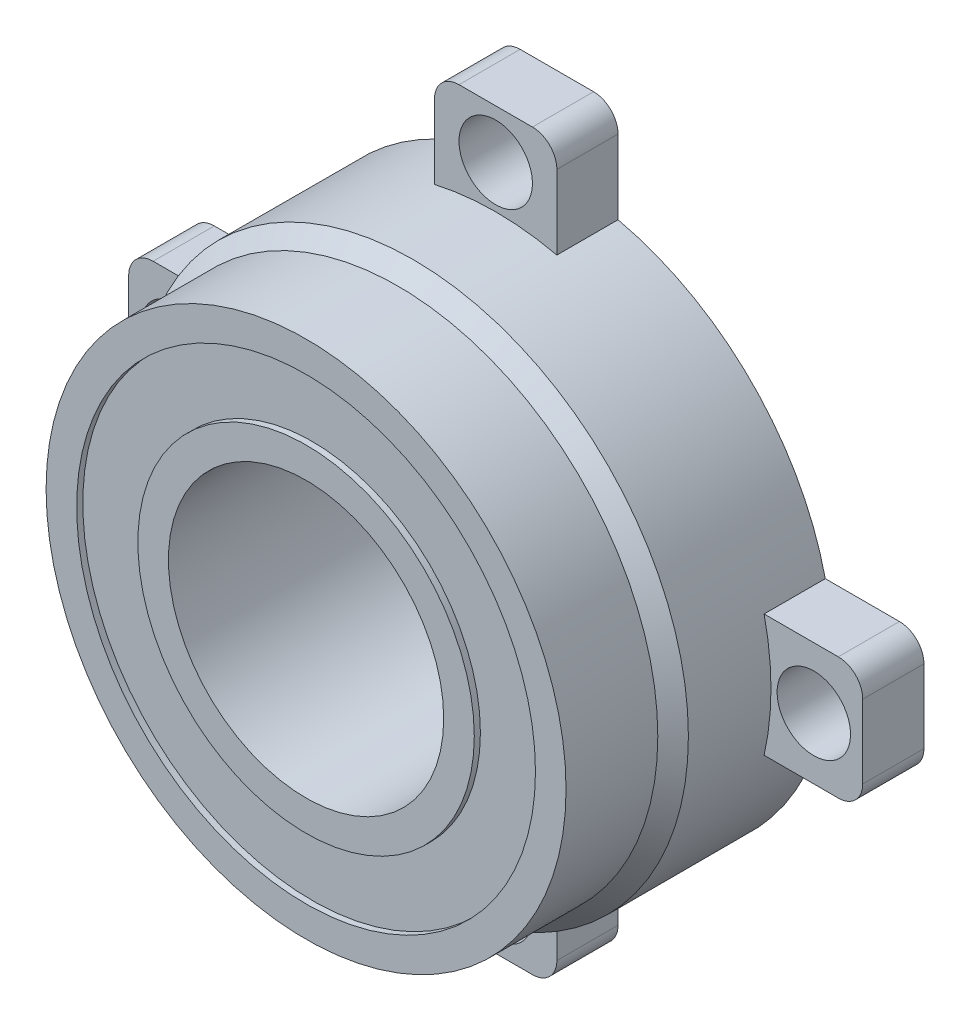
ISO-10303-21;
HEADER;
FILE_DESCRIPTION(('STEP AP214'),'2;1');
FILE_NAME('part.step','',(''),(''),'','','');
FILE_SCHEMA(('AUTOMOTIVE_DESIGN { 1 0 10303 214 1 1 1 1 }'));
ENDSEC;
DATA;
#1=APPLICATION_CONTEXT('core data for automotive mechanical design processes');
#2=APPLICATION_PROTOCOL_DEFINITION('international standard','automotive_design',2000,#1);
#3=PRODUCT_CONTEXT('',#1,'mechanical');
#4=PRODUCT('Part','Part','',(#3));
#5=PRODUCT_RELATED_PRODUCT_CATEGORY('part','',(#4));
#6=PRODUCT_DEFINITION_FORMATION('','',#4);
#7=PRODUCT_DEFINITION_CONTEXT('part definition',#1,'design');
#8=PRODUCT_DEFINITION('design','',#6,#7);
#9=PRODUCT_DEFINITION_SHAPE('','',#8);
#10=(LENGTH_UNIT() NAMED_UNIT(*) SI_UNIT(.MILLI.,.METRE.));
#11=(NAMED_UNIT(*) PLANE_ANGLE_UNIT() SI_UNIT($,.RADIAN.));
#12=(NAMED_UNIT(*) SI_UNIT($,.STERADIAN.) SOLID_ANGLE_UNIT());
#13=UNCERTAINTY_MEASURE_WITH_UNIT(LENGTH_MEASURE(1.E-05),#10,'distance_accuracy_value','');
#14=(GEOMETRIC_REPRESENTATION_CONTEXT(3) GLOBAL_UNCERTAINTY_ASSIGNED_CONTEXT((#13)) GLOBAL_UNIT_ASSIGNED_CONTEXT((#10,
#11,#12)) REPRESENTATION_CONTEXT('',''));
#15=CARTESIAN_POINT('',(0.,0.,0.));
#16=DIRECTION('',(0.,0.,1.));
#17=DIRECTION('',(1.,0.,0.));
#18=AXIS2_PLACEMENT_3D('',#15,#16,#17);
#19=CARTESIAN_POINT('',(0.,0.,41.));
#20=DIRECTION('',(0.,0.,1.));
#21=DIRECTION('',(1.,0.,0.));
#22=AXIS2_PLACEMENT_3D('',#19,#20,#21);
#23=PLANE('',#22);
#24=CARTESIAN_POINT('',(0.,0.,41.));
#25=DIRECTION('',(0.,0.,1.));
#26=DIRECTION('',(1.,0.,0.));
#27=AXIS2_PLACEMENT_3D('',#24,#25,#26);
#28=CIRCLE('',#27,22.5);
#29=CARTESIAN_POINT('',(22.5,0.,41.));
#30=VERTEX_POINT('',#29);
#31=EDGE_CURVE('E359',#30,#30,#28,.T.);
#32=ORIENTED_EDGE('',*,*,#31,.F.);
#33=EDGE_LOOP('',(#32));
#34=FACE_BOUND('',#33,.T.);
#35=CARTESIAN_POINT('',(0.,0.,41.));
#36=DIRECTION('',(0.,0.,1.));
#37=DIRECTION('',(1.,0.,0.));
#38=AXIS2_PLACEMENT_3D('',#35,#36,#37);
#39=CIRCLE('',#38,27.5);
#40=CARTESIAN_POINT('',(27.5,0.,41.));
#41=VERTEX_POINT('',#40);
#42=EDGE_CURVE('E856',#41,#41,#39,.T.);
#43=ORIENTED_EDGE('',*,*,#42,.T.);
#44=EDGE_LOOP('',(#43));
#45=FACE_BOUND('',#44,.T.);
#46=ADVANCED_FACE('F35',(#34,#45),#23,.T.);
#47=CARTESIAN_POINT('',(0.,0.,41.));
#48=DIRECTION('',(0.,0.,1.));
#49=DIRECTION('',(1.,0.,0.));
#50=AXIS2_PLACEMENT_3D('',#47,#48,#49);
#51=CIRCLE('',#50,37.5);
#52=CARTESIAN_POINT('',(37.5,0.,41.));
#53=VERTEX_POINT('',#52);
#54=EDGE_CURVE('E850',#53,#53,#51,.T.);
#55=ORIENTED_EDGE('',*,*,#54,.F.);
#56=EDGE_LOOP('',(#55));
#57=FACE_BOUND('',#56,.T.);
#58=CARTESIAN_POINT('',(0.,0.,41.));
#59=DIRECTION('',(0.,0.,1.));
#60=DIRECTION('',(1.,0.,0.));
#61=AXIS2_PLACEMENT_3D('',#58,#59,#60);
#62=CIRCLE('',#61,42.5);
#63=CARTESIAN_POINT('',(42.5,0.,41.));
#64=VERTEX_POINT('',#63);
#65=EDGE_CURVE('E836',#64,#64,#62,.T.);
#66=ORIENTED_EDGE('',*,*,#65,.T.);
#67=EDGE_LOOP('',(#66));
#68=FACE_BOUND('',#67,.T.);
#69=ADVANCED_FACE('F408',(#57,#68),#23,.T.);
#70=CARTESIAN_POINT('',(0.,0.,41.));
#71=DIRECTION('',(0.,0.,-1.));
#72=DIRECTION('',(-1.,0.,0.));
#73=AXIS2_PLACEMENT_3D('',#70,#71,#72);
#74=CYLINDRICAL_SURFACE('',#73,45.);
#75=CARTESIAN_POINT('',(0.,0.,23.5000000000001));
#76=DIRECTION('',(0.,0.,-1.));
#77=DIRECTION('',(-1.,0.,0.));
#78=AXIS2_PLACEMENT_3D('',#75,#76,#77);
#79=CIRCLE('',#78,45.);
#80=CARTESIAN_POINT('',(-45.,0.,23.5000000000001));
#81=VERTEX_POINT('',#80);
#82=EDGE_CURVE('E11',#81,#81,#79,.T.);
#83=ORIENTED_EDGE('',*,*,#82,.T.);
#84=EDGE_LOOP('',(#83));
#85=FACE_BOUND('',#84,.T.);
#86=CARTESIAN_POINT('',(0.,0.,0.));
#87=DIRECTION('',(0.,0.,1.));
#88=DIRECTION('',(1.,0.,0.));
#89=AXIS2_PLACEMENT_3D('',#86,#87,#88);
#90=CIRCLE('',#89,45.);
#91=CARTESIAN_POINT('',(9.99999999999999,-43.8748219369606,0.));
#92=VERTEX_POINT('',#91);
#93=CARTESIAN_POINT('',(43.8748219369606,-10.,0.));
#94=VERTEX_POINT('',#93);
#95=EDGE_CURVE('E429',#92,#94,#90,.T.);
#96=ORIENTED_EDGE('',*,*,#95,.T.);
#97=DIRECTION('',(0.,0.,-1.));
#98=VECTOR('',#97,1.);
#99=CARTESIAN_POINT('',(43.8748219369606,-10.,41.));
#100=LINE('',#99,#98);
#101=CARTESIAN_POINT('',(43.8748219369606,-10.,10.));
#102=VERTEX_POINT('',#101);
#103=EDGE_CURVE('E56',#94,#102,#100,.F.);
#104=ORIENTED_EDGE('',*,*,#103,.T.);
#105=CARTESIAN_POINT('',(0.,0.,10.));
#106=DIRECTION('',(0.,0.,1.));
#107=DIRECTION('',(1.,0.,0.));
#108=AXIS2_PLACEMENT_3D('',#105,#106,#107);
#109=CIRCLE('',#108,45.);
#110=CARTESIAN_POINT('',(43.8748219369606,9.99999999999999,10.));
#111=VERTEX_POINT('',#110);
#112=EDGE_CURVE('E51',#102,#111,#109,.T.);
#113=ORIENTED_EDGE('',*,*,#112,.T.);
#114=DIRECTION('',(0.,0.,-1.));
#115=VECTOR('',#114,1.);
#116=CARTESIAN_POINT('',(43.8748219369606,9.99999999999999,41.));
#117=LINE('',#116,#115);
#118=CARTESIAN_POINT('',(43.8748219369606,9.99999999999999,0.));
#119=VERTEX_POINT('',#118);
#120=EDGE_CURVE('E202',#111,#119,#117,.T.);
#121=ORIENTED_EDGE('',*,*,#120,.T.);
#122=CARTESIAN_POINT('',(10.,43.8748219369606,0.));
#123=VERTEX_POINT('',#122);
#124=EDGE_CURVE('E362',#119,#123,#90,.T.);
#125=ORIENTED_EDGE('',*,*,#124,.T.);
#126=DIRECTION('',(0.,0.,-1.));
#127=VECTOR('',#126,1.);
#128=CARTESIAN_POINT('',(10.,43.8748219369606,41.));
#129=LINE('',#128,#127);
#130=CARTESIAN_POINT('',(10.,43.8748219369606,10.));
#131=VERTEX_POINT('',#130);
#132=EDGE_CURVE('E373',#123,#131,#129,.F.);
#133=ORIENTED_EDGE('',*,*,#132,.T.);
#134=CARTESIAN_POINT('',(0.,0.,10.));
#135=DIRECTION('',(0.,0.,1.));
#136=DIRECTION('',(1.,0.,0.));
#137=AXIS2_PLACEMENT_3D('',#134,#135,#136);
#138=CIRCLE('',#137,45.);
#139=CARTESIAN_POINT('',(-10.,43.8748219369606,10.));
#140=VERTEX_POINT('',#139);
#141=EDGE_CURVE('E367',#131,#140,#138,.T.);
#142=ORIENTED_EDGE('',*,*,#141,.T.);
#143=DIRECTION('',(0.,0.,-1.));
#144=VECTOR('',#143,1.);
#145=CARTESIAN_POINT('',(-10.,43.8748219369606,41.));
#146=LINE('',#145,#144);
#147=CARTESIAN_POINT('',(-10.,43.8748219369606,0.));
#148=VERTEX_POINT('',#147);
#149=EDGE_CURVE('E370',#140,#148,#146,.T.);
#150=ORIENTED_EDGE('',*,*,#149,.T.);
#151=CARTESIAN_POINT('',(-43.8748219369606,10.,0.));
#152=VERTEX_POINT('',#151);
#153=EDGE_CURVE('E365',#148,#152,#90,.T.);
#154=ORIENTED_EDGE('',*,*,#153,.T.);
#155=DIRECTION('',(0.,0.,-1.));
#156=VECTOR('',#155,1.);
#157=CARTESIAN_POINT('',(-43.8748219369606,10.,41.));
#158=LINE('',#157,#156);
#159=CARTESIAN_POINT('',(-43.8748219369606,10.,10.));
#160=VERTEX_POINT('',#159);
#161=EDGE_CURVE('E380',#152,#160,#158,.F.);
#162=ORIENTED_EDGE('',*,*,#161,.T.);
#163=CARTESIAN_POINT('',(0.,0.,10.));
#164=DIRECTION('',(0.,0.,1.));
#165=DIRECTION('',(1.,0.,0.));
#166=AXIS2_PLACEMENT_3D('',#163,#164,#165);
#167=CIRCLE('',#166,45.);
#168=CARTESIAN_POINT('',(-43.8748219369606,-10.,10.));
#169=VERTEX_POINT('',#168);
#170=EDGE_CURVE('E375',#160,#169,#167,.T.);
#171=ORIENTED_EDGE('',*,*,#170,.T.);
#172=DIRECTION('',(0.,0.,-1.));
#173=VECTOR('',#172,1.);
#174=CARTESIAN_POINT('',(-43.8748219369606,-10.,41.));
#175=LINE('',#174,#173);
#176=CARTESIAN_POINT('',(-43.8748219369606,-10.,0.));
#177=VERTEX_POINT('',#176);
#178=EDGE_CURVE('E377',#169,#177,#175,.T.);
#179=ORIENTED_EDGE('',*,*,#178,.T.);
#180=CARTESIAN_POINT('',(-10.,-43.8748219369606,0.));
#181=VERTEX_POINT('',#180);
#182=EDGE_CURVE('E368',#177,#181,#90,.T.);
#183=ORIENTED_EDGE('',*,*,#182,.T.);
#184=DIRECTION('',(0.,0.,-1.));
#185=VECTOR('',#184,1.);
#186=CARTESIAN_POINT('',(-10.,-43.8748219369606,41.));
#187=LINE('',#186,#185);
#188=CARTESIAN_POINT('',(-10.,-43.8748219369606,10.));
#189=VERTEX_POINT('',#188);
#190=EDGE_CURVE('E387',#181,#189,#187,.F.);
#191=ORIENTED_EDGE('',*,*,#190,.T.);
#192=CARTESIAN_POINT('',(0.,0.,10.));
#193=DIRECTION('',(0.,0.,1.));
#194=DIRECTION('',(1.,0.,0.));
#195=AXIS2_PLACEMENT_3D('',#192,#193,#194);
#196=CIRCLE('',#195,45.);
#197=CARTESIAN_POINT('',(9.99999999999999,-43.8748219369606,10.));
#198=VERTEX_POINT('',#197);
#199=EDGE_CURVE('E382',#189,#198,#196,.T.);
#200=ORIENTED_EDGE('',*,*,#199,.T.);
#201=DIRECTION('',(0.,0.,-1.));
#202=VECTOR('',#201,1.);
#203=CARTESIAN_POINT('',(9.99999999999999,-43.8748219369606,41.));
#204=LINE('',#203,#202);
#205=EDGE_CURVE('E384',#198,#92,#204,.T.);
#206=ORIENTED_EDGE('',*,*,#205,.T.);
#207=EDGE_LOOP('',(#96,#104,#113,#121,#125,#133,#142,#150,#154,#162,#171,#179,#183,#191,#200,#206));
#208=FACE_BOUND('',#207,.T.);
#209=ADVANCED_FACE('F414',(#85,#208),#74,.T.);
#210=CARTESIAN_POINT('',(0.,0.,0.));
#211=DIRECTION('',(0.,0.,1.));
#212=DIRECTION('',(1.,0.,0.));
#213=AXIS2_PLACEMENT_3D('',#210,#211,#212);
#214=PLANE('',#213);
#215=CARTESIAN_POINT('',(-52.,-1.8329175309582E-13,0.));
#216=DIRECTION('',(0.,0.,-1.));
#217=DIRECTION('',(0.,-1.,0.));
#218=AXIS2_PLACEMENT_3D('',#215,#216,#217);
#219=CIRCLE('',#218,6.);
#220=CARTESIAN_POINT('',(-52.,-6.00000000000018,0.));
#221=VERTEX_POINT('',#220);
#222=EDGE_CURVE('E829',#221,#221,#219,.T.);
#223=ORIENTED_EDGE('',*,*,#222,.F.);
#224=EDGE_LOOP('',(#223));
#225=FACE_BOUND('',#224,.T.);
#226=CARTESIAN_POINT('',(0.,-52.,0.));
#227=DIRECTION('',(0.,0.,-1.));
#228=DIRECTION('',(1.,0.,0.));
#229=AXIS2_PLACEMENT_3D('',#226,#227,#228);
#230=CIRCLE('',#229,6.);
#231=CARTESIAN_POINT('',(6.,-52.,0.));
#232=VERTEX_POINT('',#231);
#233=EDGE_CURVE('E839',#232,#232,#230,.T.);
#234=ORIENTED_EDGE('',*,*,#233,.F.);
#235=EDGE_LOOP('',(#234));
#236=FACE_BOUND('',#235,.T.);
#237=CARTESIAN_POINT('',(52.,5.46405812335506E-13,0.));
#238=DIRECTION('',(0.,0.,-1.));
#239=DIRECTION('',(0.,1.,0.));
#240=AXIS2_PLACEMENT_3D('',#237,#238,#239);
#241=CIRCLE('',#240,6.);
#242=CARTESIAN_POINT('',(51.9999999999999,6.00000000000055,0.));
#243=VERTEX_POINT('',#242);
#244=EDGE_CURVE('E832',#243,#243,#241,.T.);
#245=ORIENTED_EDGE('',*,*,#244,.F.);
#246=EDGE_LOOP('',(#245));
#247=FACE_BOUND('',#246,.T.);
#248=CARTESIAN_POINT('',(0.,52.,0.));
#249=DIRECTION('',(0.,0.,-1.));
#250=DIRECTION('',(-1.,0.,0.));
#251=AXIS2_PLACEMENT_3D('',#248,#249,#250);
#252=CIRCLE('',#251,6.);
#253=CARTESIAN_POINT('',(-6.,52.,0.));
#254=VERTEX_POINT('',#253);
#255=EDGE_CURVE('E824',#254,#254,#252,.T.);
#256=ORIENTED_EDGE('',*,*,#255,.F.);
#257=EDGE_LOOP('',(#256));
#258=FACE_BOUND('',#257,.T.);
#259=DIRECTION('',(-1.,0.,0.));
#260=VECTOR('',#259,1.);
#261=CARTESIAN_POINT('',(35.,-10.,0.));
#262=LINE('',#261,#260);
#263=CARTESIAN_POINT('',(56.,-10.,0.));
#264=VERTEX_POINT('',#263);
#265=EDGE_CURVE('E206',#264,#94,#262,.T.);
#266=ORIENTED_EDGE('',*,*,#265,.T.);
#267=ORIENTED_EDGE('',*,*,#95,.F.);
#268=DIRECTION('',(0.,-1.,0.));
#269=VECTOR('',#268,1.);
#270=CARTESIAN_POINT('',(9.99999999999999,-35.,0.));
#271=LINE('',#270,#269);
#272=CARTESIAN_POINT('',(9.99999999999999,-56.,0.));
#273=VERTEX_POINT('',#272);
#274=EDGE_CURVE('E244',#92,#273,#271,.T.);
#275=ORIENTED_EDGE('',*,*,#274,.T.);
#276=CARTESIAN_POINT('',(5.99999999999999,-56.,0.));
#277=DIRECTION('',(0.,0.,-1.));
#278=DIRECTION('',(1.,0.,0.));
#279=AXIS2_PLACEMENT_3D('',#276,#277,#278);
#280=CIRCLE('',#279,4.);
#281=CARTESIAN_POINT('',(5.99999999999999,-60.,0.));
#282=VERTEX_POINT('',#281);
#283=EDGE_CURVE('E265',#273,#282,#280,.T.);
#284=ORIENTED_EDGE('',*,*,#283,.T.);
#285=DIRECTION('',(-1.,0.,0.));
#286=VECTOR('',#285,1.);
#287=CARTESIAN_POINT('',(-6.00000000000001,-60.,0.));
#288=LINE('',#287,#286);
#289=CARTESIAN_POINT('',(-6.00000000000001,-60.,0.));
#290=VERTEX_POINT('',#289);
#291=EDGE_CURVE('E268',#282,#290,#288,.T.);
#292=ORIENTED_EDGE('',*,*,#291,.T.);
#293=CARTESIAN_POINT('',(-6.00000000000001,-56.,0.));
#294=DIRECTION('',(0.,0.,-1.));
#295=DIRECTION('',(1.,0.,0.));
#296=AXIS2_PLACEMENT_3D('',#293,#294,#295);
#297=CIRCLE('',#296,4.);
#298=CARTESIAN_POINT('',(-10.,-56.,0.));
#299=VERTEX_POINT('',#298);
#300=EDGE_CURVE('E271',#290,#299,#297,.T.);
#301=ORIENTED_EDGE('',*,*,#300,.T.);
#302=DIRECTION('',(0.,1.,0.));
#303=VECTOR('',#302,1.);
#304=CARTESIAN_POINT('',(-10.,-35.,0.));
#305=LINE('',#304,#303);
#306=EDGE_CURVE('E251',#299,#181,#305,.T.);
#307=ORIENTED_EDGE('',*,*,#306,.T.);
#308=ORIENTED_EDGE('',*,*,#182,.F.);
#309=DIRECTION('',(-1.,0.,0.));
#310=VECTOR('',#309,1.);
#311=CARTESIAN_POINT('',(-35.,-10.,0.));
#312=LINE('',#311,#310);
#313=CARTESIAN_POINT('',(-56.,-9.99999999999999,0.));
#314=VERTEX_POINT('',#313);
#315=EDGE_CURVE('E278',#177,#314,#312,.T.);
#316=ORIENTED_EDGE('',*,*,#315,.T.);
#317=CARTESIAN_POINT('',(-56.,-6.,0.));
#318=DIRECTION('',(0.,0.,-1.));
#319=DIRECTION('',(1.,0.,0.));
#320=AXIS2_PLACEMENT_3D('',#317,#318,#319);
#321=CIRCLE('',#320,4.);
#322=CARTESIAN_POINT('',(-60.,-6.,0.));
#323=VERTEX_POINT('',#322);
#324=EDGE_CURVE('E302',#314,#323,#321,.T.);
#325=ORIENTED_EDGE('',*,*,#324,.T.);
#326=DIRECTION('',(0.,1.,0.));
#327=VECTOR('',#326,1.);
#328=CARTESIAN_POINT('',(-60.,6.00000000000001,0.));
#329=LINE('',#328,#327);
#330=CARTESIAN_POINT('',(-60.,6.00000000000001,0.));
#331=VERTEX_POINT('',#330);
#332=EDGE_CURVE('E305',#323,#331,#329,.T.);
#333=ORIENTED_EDGE('',*,*,#332,.T.);
#334=CARTESIAN_POINT('',(-56.,6.00000000000001,0.));
#335=DIRECTION('',(0.,0.,-1.));
#336=DIRECTION('',(1.,0.,0.));
#337=AXIS2_PLACEMENT_3D('',#334,#335,#336);
#338=CIRCLE('',#337,4.);
#339=CARTESIAN_POINT('',(-56.,10.,0.));
#340=VERTEX_POINT('',#339);
#341=EDGE_CURVE('E308',#331,#340,#338,.T.);
#342=ORIENTED_EDGE('',*,*,#341,.T.);
#343=DIRECTION('',(1.,0.,0.));
#344=VECTOR('',#343,1.);
#345=CARTESIAN_POINT('',(-35.,10.,0.));
#346=LINE('',#345,#344);
#347=EDGE_CURVE('E288',#340,#152,#346,.T.);
#348=ORIENTED_EDGE('',*,*,#347,.T.);
#349=ORIENTED_EDGE('',*,*,#153,.F.);
#350=DIRECTION('',(0.,1.,0.));
#351=VECTOR('',#350,1.);
#352=CARTESIAN_POINT('',(-10.,35.,0.));
#353=LINE('',#352,#351);
#354=CARTESIAN_POINT('',(-10.,56.,0.));
#355=VERTEX_POINT('',#354);
#356=EDGE_CURVE('E340',#148,#355,#353,.T.);
#357=ORIENTED_EDGE('',*,*,#356,.T.);
#358=CARTESIAN_POINT('',(-6.,56.,0.));
#359=DIRECTION('',(0.,0.,-1.));
#360=DIRECTION('',(1.,0.,0.));
#361=AXIS2_PLACEMENT_3D('',#358,#359,#360);
#362=CIRCLE('',#361,4.);
#363=CARTESIAN_POINT('',(-6.,60.,0.));
#364=VERTEX_POINT('',#363);
#365=EDGE_CURVE('E342',#355,#364,#362,.T.);
#366=ORIENTED_EDGE('',*,*,#365,.T.);
#367=DIRECTION('',(1.,0.,0.));
#368=VECTOR('',#367,1.);
#369=CARTESIAN_POINT('',(6.,60.,0.));
#370=LINE('',#369,#368);
#371=CARTESIAN_POINT('',(6.,60.,0.));
#372=VERTEX_POINT('',#371);
#373=EDGE_CURVE('E345',#364,#372,#370,.T.);
#374=ORIENTED_EDGE('',*,*,#373,.T.);
#375=CARTESIAN_POINT('',(6.,56.,0.));
#376=DIRECTION('',(0.,0.,-1.));
#377=DIRECTION('',(1.,0.,0.));
#378=AXIS2_PLACEMENT_3D('',#375,#376,#377);
#379=CIRCLE('',#378,4.);
#380=CARTESIAN_POINT('',(10.,56.,0.));
#381=VERTEX_POINT('',#380);
#382=EDGE_CURVE('E326',#372,#381,#379,.T.);
#383=ORIENTED_EDGE('',*,*,#382,.T.);
#384=DIRECTION('',(0.,-1.,0.));
#385=VECTOR('',#384,1.);
#386=CARTESIAN_POINT('',(10.,35.,0.));
#387=LINE('',#386,#385);
#388=EDGE_CURVE('E315',#381,#123,#387,.T.);
#389=ORIENTED_EDGE('',*,*,#388,.T.);
#390=ORIENTED_EDGE('',*,*,#124,.F.);
#391=DIRECTION('',(1.,0.,0.));
#392=VECTOR('',#391,1.);
#393=CARTESIAN_POINT('',(35.,9.99999999999999,0.));
#394=LINE('',#393,#392);
#395=CARTESIAN_POINT('',(56.,9.99999999999999,0.));
#396=VERTEX_POINT('',#395);
#397=EDGE_CURVE('E230',#119,#396,#394,.T.);
#398=ORIENTED_EDGE('',*,*,#397,.T.);
#399=CARTESIAN_POINT('',(56.,5.99999999999999,0.));
#400=DIRECTION('',(0.,0.,-1.));
#401=DIRECTION('',(1.,0.,0.));
#402=AXIS2_PLACEMENT_3D('',#399,#400,#401);
#403=CIRCLE('',#402,4.);
#404=CARTESIAN_POINT('',(60.,5.99999999999999,0.));
#405=VERTEX_POINT('',#404);
#406=EDGE_CURVE('E212',#396,#405,#403,.T.);
#407=ORIENTED_EDGE('',*,*,#406,.T.);
#408=DIRECTION('',(0.,-1.,0.));
#409=VECTOR('',#408,1.);
#410=CARTESIAN_POINT('',(60.,-6.00000000000001,0.));
#411=LINE('',#410,#409);
#412=CARTESIAN_POINT('',(60.,-6.00000000000001,0.));
#413=VERTEX_POINT('',#412);
#414=EDGE_CURVE('E234',#405,#413,#411,.T.);
#415=ORIENTED_EDGE('',*,*,#414,.T.);
#416=CARTESIAN_POINT('',(56.,-6.00000000000001,0.));
#417=DIRECTION('',(0.,0.,-1.));
#418=DIRECTION('',(1.,0.,0.));
#419=AXIS2_PLACEMENT_3D('',#416,#417,#418);
#420=CIRCLE('',#419,4.);
#421=EDGE_CURVE('E237',#413,#264,#420,.T.);
#422=ORIENTED_EDGE('',*,*,#421,.T.);
#423=EDGE_LOOP('',(#266,#267,#275,#284,#292,#301,#307,#308,#316,#325,#333,#342,#348,#349,#357,
#366,#374,#383,#389,#390,#398,#407,#415,#422));
#424=FACE_BOUND('',#423,.T.);
#425=CARTESIAN_POINT('',(0.,0.,0.));
#426=DIRECTION('',(0.,0.,1.));
#427=DIRECTION('',(1.,0.,0.));
#428=AXIS2_PLACEMENT_3D('',#425,#426,#427);
#429=CIRCLE('',#428,22.5);
#430=CARTESIAN_POINT('',(22.5,0.,0.));
#431=VERTEX_POINT('',#430);
#432=EDGE_CURVE('E352',#431,#431,#429,.T.);
#433=ORIENTED_EDGE('',*,*,#432,.T.);
#434=EDGE_LOOP('',(#433));
#435=FACE_BOUND('',#434,.T.);
#436=ADVANCED_FACE('F422',(#225,#236,#247,#258,#424,#435),#214,.F.);
#437=CARTESIAN_POINT('',(0.,0.,41.));
#438=DIRECTION('',(0.,0.,-1.));
#439=DIRECTION('',(-1.,0.,0.));
#440=AXIS2_PLACEMENT_3D('',#437,#438,#439);
#441=CYLINDRICAL_SURFACE('',#440,22.5);
#442=ORIENTED_EDGE('',*,*,#31,.T.);
#443=EDGE_LOOP('',(#442));
#444=FACE_BOUND('',#443,.T.);
#445=ORIENTED_EDGE('',*,*,#432,.F.);
#446=EDGE_LOOP('',(#445));
#447=FACE_BOUND('',#446,.T.);
#448=ADVANCED_FACE('F420',(#444,#447),#441,.F.);
#449=CARTESIAN_POINT('',(10.,35.,10.));
#450=DIRECTION('',(1.,0.,0.));
#451=DIRECTION('',(0.,0.,-1.));
#452=AXIS2_PLACEMENT_3D('',#449,#450,#451);
#453=PLANE('',#452);
#454=ORIENTED_EDGE('',*,*,#132,.F.);
#455=ORIENTED_EDGE('',*,*,#388,.F.);
#456=DIRECTION('',(0.,0.,-1.));
#457=VECTOR('',#456,1.);
#458=CARTESIAN_POINT('',(10.,56.,10.));
#459=LINE('',#458,#457);
#460=CARTESIAN_POINT('',(10.,56.,10.));
#461=VERTEX_POINT('',#460);
#462=EDGE_CURVE('E350',#461,#381,#459,.T.);
#463=ORIENTED_EDGE('',*,*,#462,.F.);
#464=DIRECTION('',(0.,-1.,0.));
#465=VECTOR('',#464,1.);
#466=CARTESIAN_POINT('',(10.,35.,10.));
#467=LINE('',#466,#465);
#468=EDGE_CURVE('E322',#461,#131,#467,.T.);
#469=ORIENTED_EDGE('',*,*,#468,.T.);
#470=EDGE_LOOP('',(#454,#455,#463,#469));
#471=FACE_BOUND('',#470,.T.);
#472=ADVANCED_FACE('F448',(#471),#453,.T.);
#473=CARTESIAN_POINT('',(-10.,35.,10.));
#474=DIRECTION('',(-1.,0.,0.));
#475=DIRECTION('',(0.,0.,1.));
#476=AXIS2_PLACEMENT_3D('',#473,#474,#475);
#477=PLANE('',#476);
#478=ORIENTED_EDGE('',*,*,#149,.F.);
#479=DIRECTION('',(0.,1.,0.));
#480=VECTOR('',#479,1.);
#481=CARTESIAN_POINT('',(-10.,35.,10.));
#482=LINE('',#481,#480);
#483=CARTESIAN_POINT('',(-10.,56.,10.));
#484=VERTEX_POINT('',#483);
#485=EDGE_CURVE('E325',#140,#484,#482,.T.);
#486=ORIENTED_EDGE('',*,*,#485,.T.);
#487=DIRECTION('',(0.,0.,-1.));
#488=VECTOR('',#487,1.);
#489=CARTESIAN_POINT('',(-10.,56.,10.));
#490=LINE('',#489,#488);
#491=EDGE_CURVE('E337',#484,#355,#490,.T.);
#492=ORIENTED_EDGE('',*,*,#491,.T.);
#493=ORIENTED_EDGE('',*,*,#356,.F.);
#494=EDGE_LOOP('',(#478,#486,#492,#493));
#495=FACE_BOUND('',#494,.T.);
#496=ADVANCED_FACE('F469',(#495),#477,.T.);
#497=CARTESIAN_POINT('',(6.,56.,10.));
#498=DIRECTION('',(0.,0.,-1.));
#499=DIRECTION('',(-1.,0.,0.));
#500=AXIS2_PLACEMENT_3D('',#497,#498,#499);
#501=CYLINDRICAL_SURFACE('',#500,4.);
#502=ORIENTED_EDGE('',*,*,#382,.F.);
#503=DIRECTION('',(0.,0.,-1.));
#504=VECTOR('',#503,1.);
#505=CARTESIAN_POINT('',(6.,60.,10.));
#506=LINE('',#505,#504);
#507=CARTESIAN_POINT('',(6.,60.,10.));
#508=VERTEX_POINT('',#507);
#509=EDGE_CURVE('E353',#508,#372,#506,.T.);
#510=ORIENTED_EDGE('',*,*,#509,.F.);
#511=CARTESIAN_POINT('',(6.,56.,10.));
#512=DIRECTION('',(0.,0.,-1.));
#513=DIRECTION('',(1.,0.,0.));
#514=AXIS2_PLACEMENT_3D('',#511,#512,#513);
#515=CIRCLE('',#514,4.);
#516=EDGE_CURVE('E334',#508,#461,#515,.T.);
#517=ORIENTED_EDGE('',*,*,#516,.T.);
#518=ORIENTED_EDGE('',*,*,#462,.T.);
#519=EDGE_LOOP('',(#502,#510,#517,#518));
#520=FACE_BOUND('',#519,.T.);
#521=ADVANCED_FACE('F457',(#520),#501,.T.);
#522=CARTESIAN_POINT('',(6.,60.,10.));
#523=DIRECTION('',(0.,1.,0.));
#524=DIRECTION('',(0.,0.,1.));
#525=AXIS2_PLACEMENT_3D('',#522,#523,#524);
#526=PLANE('',#525);
#527=ORIENTED_EDGE('',*,*,#373,.F.);
#528=DIRECTION('',(0.,0.,-1.));
#529=VECTOR('',#528,1.);
#530=CARTESIAN_POINT('',(-6.,60.,10.));
#531=LINE('',#530,#529);
#532=CARTESIAN_POINT('',(-6.,60.,10.));
#533=VERTEX_POINT('',#532);
#534=EDGE_CURVE('E355',#533,#364,#531,.T.);
#535=ORIENTED_EDGE('',*,*,#534,.F.);
#536=DIRECTION('',(1.,0.,0.));
#537=VECTOR('',#536,1.);
#538=CARTESIAN_POINT('',(6.,60.,10.));
#539=LINE('',#538,#537);
#540=EDGE_CURVE('E331',#533,#508,#539,.T.);
#541=ORIENTED_EDGE('',*,*,#540,.T.);
#542=ORIENTED_EDGE('',*,*,#509,.T.);
#543=EDGE_LOOP('',(#527,#535,#541,#542));
#544=FACE_BOUND('',#543,.T.);
#545=ADVANCED_FACE('F460',(#544),#526,.T.);
#546=CARTESIAN_POINT('',(-6.,56.,10.));
#547=DIRECTION('',(0.,0.,-1.));
#548=DIRECTION('',(-1.,0.,0.));
#549=AXIS2_PLACEMENT_3D('',#546,#547,#548);
#550=CYLINDRICAL_SURFACE('',#549,4.);
#551=ORIENTED_EDGE('',*,*,#365,.F.);
#552=ORIENTED_EDGE('',*,*,#491,.F.);
#553=CARTESIAN_POINT('',(-6.,56.,10.));
#554=DIRECTION('',(0.,0.,-1.));
#555=DIRECTION('',(1.,0.,0.));
#556=AXIS2_PLACEMENT_3D('',#553,#554,#555);
#557=CIRCLE('',#556,4.);
#558=EDGE_CURVE('E328',#484,#533,#557,.T.);
#559=ORIENTED_EDGE('',*,*,#558,.T.);
#560=ORIENTED_EDGE('',*,*,#534,.T.);
#561=EDGE_LOOP('',(#551,#552,#559,#560));
#562=FACE_BOUND('',#561,.T.);
#563=ADVANCED_FACE('F465',(#562),#550,.T.);
#564=CARTESIAN_POINT('',(6.,56.,10.));
#565=DIRECTION('',(0.,0.,1.));
#566=DIRECTION('',(1.,0.,0.));
#567=AXIS2_PLACEMENT_3D('',#564,#565,#566);
#568=PLANE('',#567);
#569=CARTESIAN_POINT('',(0.,52.,10.));
#570=DIRECTION('',(0.,0.,-1.));
#571=DIRECTION('',(-1.,0.,0.));
#572=AXIS2_PLACEMENT_3D('',#569,#570,#571);
#573=CIRCLE('',#572,6.);
#574=CARTESIAN_POINT('',(-6.,52.,10.));
#575=VERTEX_POINT('',#574);
#576=EDGE_CURVE('E232',#575,#575,#573,.T.);
#577=ORIENTED_EDGE('',*,*,#576,.T.);
#578=EDGE_LOOP('',(#577));
#579=FACE_BOUND('',#578,.T.);
#580=ORIENTED_EDGE('',*,*,#141,.F.);
#581=ORIENTED_EDGE('',*,*,#468,.F.);
#582=ORIENTED_EDGE('',*,*,#516,.F.);
#583=ORIENTED_EDGE('',*,*,#540,.F.);
#584=ORIENTED_EDGE('',*,*,#558,.F.);
#585=ORIENTED_EDGE('',*,*,#485,.F.);
#586=EDGE_LOOP('',(#580,#581,#582,#583,#584,#585));
#587=FACE_BOUND('',#586,.T.);
#588=ADVANCED_FACE('F452',(#579,#587),#568,.T.);
#589=CARTESIAN_POINT('',(-35.,10.,10.));
#590=DIRECTION('',(0.,1.,0.));
#591=DIRECTION('',(-1.,0.,0.));
#592=AXIS2_PLACEMENT_3D('',#589,#590,#591);
#593=PLANE('',#592);
#594=ORIENTED_EDGE('',*,*,#161,.F.);
#595=ORIENTED_EDGE('',*,*,#347,.F.);
#596=DIRECTION('',(0.,0.,-1.));
#597=VECTOR('',#596,1.);
#598=CARTESIAN_POINT('',(-56.,10.,10.));
#599=LINE('',#598,#597);
#600=CARTESIAN_POINT('',(-56.,10.,10.));
#601=VERTEX_POINT('',#600);
#602=EDGE_CURVE('E313',#601,#340,#599,.T.);
#603=ORIENTED_EDGE('',*,*,#602,.F.);
#604=DIRECTION('',(1.,0.,0.));
#605=VECTOR('',#604,1.);
#606=CARTESIAN_POINT('',(-35.,10.,10.));
#607=LINE('',#606,#605);
#608=EDGE_CURVE('E297',#601,#160,#607,.T.);
#609=ORIENTED_EDGE('',*,*,#608,.T.);
#610=EDGE_LOOP('',(#594,#595,#603,#609));
#611=FACE_BOUND('',#610,.T.);
#612=ADVANCED_FACE('F474',(#611),#593,.T.);
#613=CARTESIAN_POINT('',(-35.,-10.,10.));
#614=DIRECTION('',(0.,-1.,0.));
#615=DIRECTION('',(1.,0.,0.));
#616=AXIS2_PLACEMENT_3D('',#613,#614,#615);
#617=PLANE('',#616);
#618=ORIENTED_EDGE('',*,*,#178,.F.);
#619=DIRECTION('',(-1.,0.,0.));
#620=VECTOR('',#619,1.);
#621=CARTESIAN_POINT('',(-35.,-10.,10.));
#622=LINE('',#621,#620);
#623=CARTESIAN_POINT('',(-56.,-9.99999999999999,10.));
#624=VERTEX_POINT('',#623);
#625=EDGE_CURVE('E285',#169,#624,#622,.T.);
#626=ORIENTED_EDGE('',*,*,#625,.T.);
#627=DIRECTION('',(0.,0.,-1.));
#628=VECTOR('',#627,1.);
#629=CARTESIAN_POINT('',(-56.,-9.99999999999999,10.));
#630=LINE('',#629,#628);
#631=EDGE_CURVE('E300',#624,#314,#630,.T.);
#632=ORIENTED_EDGE('',*,*,#631,.T.);
#633=ORIENTED_EDGE('',*,*,#315,.F.);
#634=EDGE_LOOP('',(#618,#626,#632,#633));
#635=FACE_BOUND('',#634,.T.);
#636=ADVANCED_FACE('F489',(#635),#617,.T.);
#637=CARTESIAN_POINT('',(-56.,6.00000000000001,10.));
#638=DIRECTION('',(0.,0.,-1.));
#639=DIRECTION('',(-1.,0.,0.));
#640=AXIS2_PLACEMENT_3D('',#637,#638,#639);
#641=CYLINDRICAL_SURFACE('',#640,4.);
#642=ORIENTED_EDGE('',*,*,#341,.F.);
#643=DIRECTION('',(0.,0.,-1.));
#644=VECTOR('',#643,1.);
#645=CARTESIAN_POINT('',(-60.,6.00000000000001,10.));
#646=LINE('',#645,#644);
#647=CARTESIAN_POINT('',(-60.,6.00000000000001,10.));
#648=VERTEX_POINT('',#647);
#649=EDGE_CURVE('E316',#648,#331,#646,.T.);
#650=ORIENTED_EDGE('',*,*,#649,.F.);
#651=CARTESIAN_POINT('',(-56.,6.00000000000001,10.));
#652=DIRECTION('',(0.,0.,-1.));
#653=DIRECTION('',(1.,0.,0.));
#654=AXIS2_PLACEMENT_3D('',#651,#652,#653);
#655=CIRCLE('',#654,4.);
#656=EDGE_CURVE('E294',#648,#601,#655,.T.);
#657=ORIENTED_EDGE('',*,*,#656,.T.);
#658=ORIENTED_EDGE('',*,*,#602,.T.);
#659=EDGE_LOOP('',(#642,#650,#657,#658));
#660=FACE_BOUND('',#659,.T.);
#661=ADVANCED_FACE('F479',(#660),#641,.T.);
#662=CARTESIAN_POINT('',(-60.,6.00000000000001,10.));
#663=DIRECTION('',(-1.,0.,0.));
#664=DIRECTION('',(0.,0.,1.));
#665=AXIS2_PLACEMENT_3D('',#662,#663,#664);
#666=PLANE('',#665);
#667=ORIENTED_EDGE('',*,*,#332,.F.);
#668=DIRECTION('',(0.,0.,-1.));
#669=VECTOR('',#668,1.);
#670=CARTESIAN_POINT('',(-60.,-6.,10.));
#671=LINE('',#670,#669);
#672=CARTESIAN_POINT('',(-60.,-6.,10.));
#673=VERTEX_POINT('',#672);
#674=EDGE_CURVE('E318',#673,#323,#671,.T.);
#675=ORIENTED_EDGE('',*,*,#674,.F.);
#676=DIRECTION('',(0.,1.,0.));
#677=VECTOR('',#676,1.);
#678=CARTESIAN_POINT('',(-60.,6.00000000000001,10.));
#679=LINE('',#678,#677);
#680=EDGE_CURVE('E291',#673,#648,#679,.T.);
#681=ORIENTED_EDGE('',*,*,#680,.T.);
#682=ORIENTED_EDGE('',*,*,#649,.T.);
#683=EDGE_LOOP('',(#667,#675,#681,#682));
#684=FACE_BOUND('',#683,.T.);
#685=ADVANCED_FACE('F537',(#684),#666,.T.);
#686=CARTESIAN_POINT('',(-56.,-6.,10.));
#687=DIRECTION('',(0.,0.,-1.));
#688=DIRECTION('',(-1.,0.,0.));
#689=AXIS2_PLACEMENT_3D('',#686,#687,#688);
#690=CYLINDRICAL_SURFACE('',#689,4.);
#691=ORIENTED_EDGE('',*,*,#324,.F.);
#692=ORIENTED_EDGE('',*,*,#631,.F.);
#693=CARTESIAN_POINT('',(-56.,-6.,10.));
#694=DIRECTION('',(0.,0.,-1.));
#695=DIRECTION('',(1.,0.,0.));
#696=AXIS2_PLACEMENT_3D('',#693,#694,#695);
#697=CIRCLE('',#696,4.);
#698=EDGE_CURVE('E287',#624,#673,#697,.T.);
#699=ORIENTED_EDGE('',*,*,#698,.T.);
#700=ORIENTED_EDGE('',*,*,#674,.T.);
#701=EDGE_LOOP('',(#691,#692,#699,#700));
#702=FACE_BOUND('',#701,.T.);
#703=ADVANCED_FACE('F531',(#702),#690,.T.);
#704=CARTESIAN_POINT('',(-56.,-6.,10.));
#705=DIRECTION('',(0.,0.,1.));
#706=DIRECTION('',(1.,0.,0.));
#707=AXIS2_PLACEMENT_3D('',#704,#705,#706);
#708=PLANE('',#707);
#709=CARTESIAN_POINT('',(-52.,-1.8329175309582E-13,10.));
#710=DIRECTION('',(0.,0.,-1.));
#711=DIRECTION('',(0.,-1.,0.));
#712=AXIS2_PLACEMENT_3D('',#709,#710,#711);
#713=CIRCLE('',#712,6.);
#714=CARTESIAN_POINT('',(-52.,-6.00000000000018,10.));
#715=VERTEX_POINT('',#714);
#716=EDGE_CURVE('E826',#715,#715,#713,.T.);
#717=ORIENTED_EDGE('',*,*,#716,.T.);
#718=EDGE_LOOP('',(#717));
#719=FACE_BOUND('',#718,.T.);
#720=ORIENTED_EDGE('',*,*,#170,.F.);
#721=ORIENTED_EDGE('',*,*,#608,.F.);
#722=ORIENTED_EDGE('',*,*,#656,.F.);
#723=ORIENTED_EDGE('',*,*,#680,.F.);
#724=ORIENTED_EDGE('',*,*,#698,.F.);
#725=ORIENTED_EDGE('',*,*,#625,.F.);
#726=EDGE_LOOP('',(#720,#721,#722,#723,#724,#725));
#727=FACE_BOUND('',#726,.T.);
#728=ADVANCED_FACE('F483',(#719,#727),#708,.T.);
#729=CARTESIAN_POINT('',(-10.,-35.,10.));
#730=DIRECTION('',(-1.,0.,0.));
#731=DIRECTION('',(0.,-1.,0.));
#732=AXIS2_PLACEMENT_3D('',#729,#730,#731);
#733=PLANE('',#732);
#734=ORIENTED_EDGE('',*,*,#190,.F.);
#735=ORIENTED_EDGE('',*,*,#306,.F.);
#736=DIRECTION('',(0.,0.,-1.));
#737=VECTOR('',#736,1.);
#738=CARTESIAN_POINT('',(-10.,-56.,10.));
#739=LINE('',#738,#737);
#740=CARTESIAN_POINT('',(-10.,-56.,10.));
#741=VERTEX_POINT('',#740);
#742=EDGE_CURVE('E276',#741,#299,#739,.T.);
#743=ORIENTED_EDGE('',*,*,#742,.F.);
#744=DIRECTION('',(0.,1.,0.));
#745=VECTOR('',#744,1.);
#746=CARTESIAN_POINT('',(-10.,-35.,10.));
#747=LINE('',#746,#745);
#748=EDGE_CURVE('E260',#741,#189,#747,.T.);
#749=ORIENTED_EDGE('',*,*,#748,.T.);
#750=EDGE_LOOP('',(#734,#735,#743,#749));
#751=FACE_BOUND('',#750,.T.);
#752=ADVANCED_FACE('F496',(#751),#733,.T.);
#753=CARTESIAN_POINT('',(9.99999999999999,-35.,10.));
#754=DIRECTION('',(1.,0.,0.));
#755=DIRECTION('',(0.,0.,-1.));
#756=AXIS2_PLACEMENT_3D('',#753,#754,#755);
#757=PLANE('',#756);
#758=ORIENTED_EDGE('',*,*,#205,.F.);
#759=DIRECTION('',(0.,-1.,0.));
#760=VECTOR('',#759,1.);
#761=CARTESIAN_POINT('',(9.99999999999999,-35.,10.));
#762=LINE('',#761,#760);
#763=CARTESIAN_POINT('',(9.99999999999999,-56.,10.));
#764=VERTEX_POINT('',#763);
#765=EDGE_CURVE('E248',#198,#764,#762,.T.);
#766=ORIENTED_EDGE('',*,*,#765,.T.);
#767=DIRECTION('',(0.,0.,-1.));
#768=VECTOR('',#767,1.);
#769=CARTESIAN_POINT('',(9.99999999999999,-56.,10.));
#770=LINE('',#769,#768);
#771=EDGE_CURVE('E263',#764,#273,#770,.T.);
#772=ORIENTED_EDGE('',*,*,#771,.T.);
#773=ORIENTED_EDGE('',*,*,#274,.F.);
#774=EDGE_LOOP('',(#758,#766,#772,#773));
#775=FACE_BOUND('',#774,.T.);
#776=ADVANCED_FACE('F505',(#775),#757,.T.);
#777=CARTESIAN_POINT('',(-6.00000000000001,-56.,10.));
#778=DIRECTION('',(0.,0.,-1.));
#779=DIRECTION('',(-1.,0.,0.));
#780=AXIS2_PLACEMENT_3D('',#777,#778,#779);
#781=CYLINDRICAL_SURFACE('',#780,4.);
#782=ORIENTED_EDGE('',*,*,#300,.F.);
#783=DIRECTION('',(0.,0.,-1.));
#784=VECTOR('',#783,1.);
#785=CARTESIAN_POINT('',(-6.00000000000001,-60.,10.));
#786=LINE('',#785,#784);
#787=CARTESIAN_POINT('',(-6.00000000000001,-60.,10.));
#788=VERTEX_POINT('',#787);
#789=EDGE_CURVE('E279',#788,#290,#786,.T.);
#790=ORIENTED_EDGE('',*,*,#789,.F.);
#791=CARTESIAN_POINT('',(-6.00000000000001,-56.,10.));
#792=DIRECTION('',(0.,0.,-1.));
#793=DIRECTION('',(1.,0.,0.));
#794=AXIS2_PLACEMENT_3D('',#791,#792,#793);
#795=CIRCLE('',#794,4.);
#796=EDGE_CURVE('E257',#788,#741,#795,.T.);
#797=ORIENTED_EDGE('',*,*,#796,.T.);
#798=ORIENTED_EDGE('',*,*,#742,.T.);
#799=EDGE_LOOP('',(#782,#790,#797,#798));
#800=FACE_BOUND('',#799,.T.);
#801=ADVANCED_FACE('F515',(#800),#781,.T.);
#802=CARTESIAN_POINT('',(-6.00000000000001,-60.,10.));
#803=DIRECTION('',(0.,-1.,0.));
#804=DIRECTION('',(0.,0.,-1.));
#805=AXIS2_PLACEMENT_3D('',#802,#803,#804);
#806=PLANE('',#805);
#807=ORIENTED_EDGE('',*,*,#291,.F.);
#808=DIRECTION('',(0.,0.,-1.));
#809=VECTOR('',#808,1.);
#810=CARTESIAN_POINT('',(5.99999999999999,-60.,10.));
#811=LINE('',#810,#809);
#812=CARTESIAN_POINT('',(5.99999999999999,-60.,10.));
#813=VERTEX_POINT('',#812);
#814=EDGE_CURVE('E281',#813,#282,#811,.T.);
#815=ORIENTED_EDGE('',*,*,#814,.F.);
#816=DIRECTION('',(-1.,0.,0.));
#817=VECTOR('',#816,1.);
#818=CARTESIAN_POINT('',(-6.00000000000001,-60.,10.));
#819=LINE('',#818,#817);
#820=EDGE_CURVE('E254',#813,#788,#819,.T.);
#821=ORIENTED_EDGE('',*,*,#820,.T.);
#822=ORIENTED_EDGE('',*,*,#789,.T.);
#823=EDGE_LOOP('',(#807,#815,#821,#822));
#824=FACE_BOUND('',#823,.T.);
#825=ADVANCED_FACE('F512',(#824),#806,.T.);
#826=CARTESIAN_POINT('',(5.99999999999999,-56.,10.));
#827=DIRECTION('',(0.,0.,-1.));
#828=DIRECTION('',(-1.,0.,0.));
#829=AXIS2_PLACEMENT_3D('',#826,#827,#828);
#830=CYLINDRICAL_SURFACE('',#829,4.);
#831=ORIENTED_EDGE('',*,*,#283,.F.);
#832=ORIENTED_EDGE('',*,*,#771,.F.);
#833=CARTESIAN_POINT('',(5.99999999999999,-56.,10.));
#834=DIRECTION('',(0.,0.,-1.));
#835=DIRECTION('',(1.,0.,0.));
#836=AXIS2_PLACEMENT_3D('',#833,#834,#835);
#837=CIRCLE('',#836,4.);
#838=EDGE_CURVE('E250',#764,#813,#837,.T.);
#839=ORIENTED_EDGE('',*,*,#838,.T.);
#840=ORIENTED_EDGE('',*,*,#814,.T.);
#841=EDGE_LOOP('',(#831,#832,#839,#840));
#842=FACE_BOUND('',#841,.T.);
#843=ADVANCED_FACE('F510',(#842),#830,.T.);
#844=CARTESIAN_POINT('',(5.99999999999999,-56.,10.));
#845=DIRECTION('',(0.,0.,1.));
#846=DIRECTION('',(1.,0.,0.));
#847=AXIS2_PLACEMENT_3D('',#844,#845,#846);
#848=PLANE('',#847);
#849=CARTESIAN_POINT('',(0.,-52.,10.));
#850=DIRECTION('',(0.,0.,-1.));
#851=DIRECTION('',(1.,0.,0.));
#852=AXIS2_PLACEMENT_3D('',#849,#850,#851);
#853=CIRCLE('',#852,6.);
#854=CARTESIAN_POINT('',(6.,-52.,10.));
#855=VERTEX_POINT('',#854);
#856=EDGE_CURVE('E842',#855,#855,#853,.T.);
#857=ORIENTED_EDGE('',*,*,#856,.T.);
#858=EDGE_LOOP('',(#857));
#859=FACE_BOUND('',#858,.T.);
#860=ORIENTED_EDGE('',*,*,#199,.F.);
#861=ORIENTED_EDGE('',*,*,#748,.F.);
#862=ORIENTED_EDGE('',*,*,#796,.F.);
#863=ORIENTED_EDGE('',*,*,#820,.F.);
#864=ORIENTED_EDGE('',*,*,#838,.F.);
#865=ORIENTED_EDGE('',*,*,#765,.F.);
#866=EDGE_LOOP('',(#860,#861,#862,#863,#864,#865));
#867=FACE_BOUND('',#866,.T.);
#868=ADVANCED_FACE('F500',(#859,#867),#848,.T.);
#869=CARTESIAN_POINT('',(35.,-10.,10.));
#870=DIRECTION('',(0.,-1.,0.));
#871=DIRECTION('',(1.,0.,0.));
#872=AXIS2_PLACEMENT_3D('',#869,#870,#871);
#873=PLANE('',#872);
#874=ORIENTED_EDGE('',*,*,#103,.F.);
#875=ORIENTED_EDGE('',*,*,#265,.F.);
#876=DIRECTION('',(0.,0.,-1.));
#877=VECTOR('',#876,1.);
#878=CARTESIAN_POINT('',(56.,-10.,10.));
#879=LINE('',#878,#877);
#880=CARTESIAN_POINT('',(56.,-10.,10.));
#881=VERTEX_POINT('',#880);
#882=EDGE_CURVE('E242',#881,#264,#879,.T.);
#883=ORIENTED_EDGE('',*,*,#882,.F.);
#884=DIRECTION('',(-1.,0.,0.));
#885=VECTOR('',#884,1.);
#886=CARTESIAN_POINT('',(35.,-10.,10.));
#887=LINE('',#886,#885);
#888=EDGE_CURVE('E214',#881,#102,#887,.T.);
#889=ORIENTED_EDGE('',*,*,#888,.T.);
#890=EDGE_LOOP('',(#874,#875,#883,#889));
#891=FACE_BOUND('',#890,.T.);
#892=ADVANCED_FACE('F435',(#891),#873,.T.);
#893=CARTESIAN_POINT('',(35.,9.99999999999999,10.));
#894=DIRECTION('',(0.,1.,0.));
#895=DIRECTION('',(0.,0.,1.));
#896=AXIS2_PLACEMENT_3D('',#893,#894,#895);
#897=PLANE('',#896);
#898=ORIENTED_EDGE('',*,*,#120,.F.);
#899=DIRECTION('',(1.,0.,0.));
#900=VECTOR('',#899,1.);
#901=CARTESIAN_POINT('',(35.,9.99999999999999,10.));
#902=LINE('',#901,#900);
#903=CARTESIAN_POINT('',(56.,9.99999999999999,10.));
#904=VERTEX_POINT('',#903);
#905=EDGE_CURVE('E196',#111,#904,#902,.T.);
#906=ORIENTED_EDGE('',*,*,#905,.T.);
#907=DIRECTION('',(0.,0.,-1.));
#908=VECTOR('',#907,1.);
#909=CARTESIAN_POINT('',(56.,9.99999999999999,10.));
#910=LINE('',#909,#908);
#911=EDGE_CURVE('E200',#904,#396,#910,.T.);
#912=ORIENTED_EDGE('',*,*,#911,.T.);
#913=ORIENTED_EDGE('',*,*,#397,.F.);
#914=EDGE_LOOP('',(#898,#906,#912,#913));
#915=FACE_BOUND('',#914,.T.);
#916=ADVANCED_FACE('F198',(#915),#897,.T.);
#917=CARTESIAN_POINT('',(56.,-6.00000000000001,10.));
#918=DIRECTION('',(0.,0.,-1.));
#919=DIRECTION('',(-1.,0.,0.));
#920=AXIS2_PLACEMENT_3D('',#917,#918,#919);
#921=CYLINDRICAL_SURFACE('',#920,4.);
#922=ORIENTED_EDGE('',*,*,#421,.F.);
#923=DIRECTION('',(0.,0.,-1.));
#924=VECTOR('',#923,1.);
#925=CARTESIAN_POINT('',(60.,-6.00000000000001,10.));
#926=LINE('',#925,#924);
#927=CARTESIAN_POINT('',(60.,-6.00000000000001,10.));
#928=VERTEX_POINT('',#927);
#929=EDGE_CURVE('E245',#928,#413,#926,.T.);
#930=ORIENTED_EDGE('',*,*,#929,.F.);
#931=CARTESIAN_POINT('',(56.,-6.00000000000001,10.));
#932=DIRECTION('',(0.,0.,-1.));
#933=DIRECTION('',(1.,0.,0.));
#934=AXIS2_PLACEMENT_3D('',#931,#932,#933);
#935=CIRCLE('',#934,4.);
#936=EDGE_CURVE('E222',#928,#881,#935,.T.);
#937=ORIENTED_EDGE('',*,*,#936,.T.);
#938=ORIENTED_EDGE('',*,*,#882,.T.);
#939=EDGE_LOOP('',(#922,#930,#937,#938));
#940=FACE_BOUND('',#939,.T.);
#941=ADVANCED_FACE('F441',(#940),#921,.T.);
#942=CARTESIAN_POINT('',(60.,-6.00000000000001,10.));
#943=DIRECTION('',(1.,0.,0.));
#944=DIRECTION('',(0.,0.,-1.));
#945=AXIS2_PLACEMENT_3D('',#942,#943,#944);
#946=PLANE('',#945);
#947=ORIENTED_EDGE('',*,*,#414,.F.);
#948=DIRECTION('',(0.,0.,-1.));
#949=VECTOR('',#948,1.);
#950=CARTESIAN_POINT('',(60.,5.99999999999999,10.));
#951=LINE('',#950,#949);
#952=CARTESIAN_POINT('',(60.,5.99999999999999,10.));
#953=VERTEX_POINT('',#952);
#954=EDGE_CURVE('E213',#953,#405,#951,.T.);
#955=ORIENTED_EDGE('',*,*,#954,.F.);
#956=DIRECTION('',(0.,-1.,0.));
#957=VECTOR('',#956,1.);
#958=CARTESIAN_POINT('',(60.,-6.00000000000001,10.));
#959=LINE('',#958,#957);
#960=EDGE_CURVE('E220',#953,#928,#959,.T.);
#961=ORIENTED_EDGE('',*,*,#960,.T.);
#962=ORIENTED_EDGE('',*,*,#929,.T.);
#963=EDGE_LOOP('',(#947,#955,#961,#962));
#964=FACE_BOUND('',#963,.T.);
#965=ADVANCED_FACE('F443',(#964),#946,.T.);
#966=CARTESIAN_POINT('',(56.,5.99999999999999,10.));
#967=DIRECTION('',(0.,0.,-1.));
#968=DIRECTION('',(-1.,0.,0.));
#969=AXIS2_PLACEMENT_3D('',#966,#967,#968);
#970=CYLINDRICAL_SURFACE('',#969,4.);
#971=ORIENTED_EDGE('',*,*,#406,.F.);
#972=ORIENTED_EDGE('',*,*,#911,.F.);
#973=CARTESIAN_POINT('',(56.,5.99999999999999,10.));
#974=DIRECTION('',(0.,0.,-1.));
#975=DIRECTION('',(1.,0.,0.));
#976=AXIS2_PLACEMENT_3D('',#973,#974,#975);
#977=CIRCLE('',#976,4.);
#978=EDGE_CURVE('E205',#904,#953,#977,.T.);
#979=ORIENTED_EDGE('',*,*,#978,.T.);
#980=ORIENTED_EDGE('',*,*,#954,.T.);
#981=EDGE_LOOP('',(#971,#972,#979,#980));
#982=FACE_BOUND('',#981,.T.);
#983=ADVANCED_FACE('F210',(#982),#970,.T.);
#984=CARTESIAN_POINT('',(56.,5.99999999999999,10.));
#985=DIRECTION('',(0.,0.,1.));
#986=DIRECTION('',(1.,0.,0.));
#987=AXIS2_PLACEMENT_3D('',#984,#985,#986);
#988=PLANE('',#987);
#989=CARTESIAN_POINT('',(52.,5.46405812335506E-13,10.));
#990=DIRECTION('',(0.,0.,-1.));
#991=DIRECTION('',(0.,1.,0.));
#992=AXIS2_PLACEMENT_3D('',#989,#990,#991);
#993=CIRCLE('',#992,6.);
#994=CARTESIAN_POINT('',(51.9999999999999,6.00000000000055,10.));
#995=VERTEX_POINT('',#994);
#996=EDGE_CURVE('E835',#995,#995,#993,.T.);
#997=ORIENTED_EDGE('',*,*,#996,.T.);
#998=EDGE_LOOP('',(#997));
#999=FACE_BOUND('',#998,.T.);
#1000=ORIENTED_EDGE('',*,*,#112,.F.);
#1001=ORIENTED_EDGE('',*,*,#888,.F.);
#1002=ORIENTED_EDGE('',*,*,#936,.F.);
#1003=ORIENTED_EDGE('',*,*,#960,.F.);
#1004=ORIENTED_EDGE('',*,*,#978,.F.);
#1005=ORIENTED_EDGE('',*,*,#905,.F.);
#1006=EDGE_LOOP('',(#1000,#1001,#1002,#1003,#1004,#1005));
#1007=FACE_BOUND('',#1006,.T.);
#1008=ADVANCED_FACE('F217',(#999,#1007),#988,.T.);
#1009=CARTESIAN_POINT('',(0.,52.,10.));
#1010=DIRECTION('',(0.,0.,-1.));
#1011=DIRECTION('',(-1.,0.,0.));
#1012=AXIS2_PLACEMENT_3D('',#1009,#1010,#1011);
#1013=CYLINDRICAL_SURFACE('',#1012,6.);
#1014=ORIENTED_EDGE('',*,*,#576,.F.);
#1015=EDGE_LOOP('',(#1014));
#1016=FACE_BOUND('',#1015,.T.);
#1017=ORIENTED_EDGE('',*,*,#255,.T.);
#1018=EDGE_LOOP('',(#1017));
#1019=FACE_BOUND('',#1018,.T.);
#1020=ADVANCED_FACE('F577',(#1016,#1019),#1013,.F.);
#1021=CARTESIAN_POINT('',(52.,5.46405812335506E-13,10.));
#1022=DIRECTION('',(0.,0.,-1.));
#1023=DIRECTION('',(-1.,0.,0.));
#1024=AXIS2_PLACEMENT_3D('',#1021,#1022,#1023);
#1025=CYLINDRICAL_SURFACE('',#1024,6.);
#1026=ORIENTED_EDGE('',*,*,#996,.F.);
#1027=EDGE_LOOP('',(#1026));
#1028=FACE_BOUND('',#1027,.T.);
#1029=ORIENTED_EDGE('',*,*,#244,.T.);
#1030=EDGE_LOOP('',(#1029));
#1031=FACE_BOUND('',#1030,.T.);
#1032=ADVANCED_FACE('F613',(#1028,#1031),#1025,.F.);
#1033=CARTESIAN_POINT('',(0.,-52.,10.));
#1034=DIRECTION('',(0.,0.,-1.));
#1035=DIRECTION('',(-1.,0.,0.));
#1036=AXIS2_PLACEMENT_3D('',#1033,#1034,#1035);
#1037=CYLINDRICAL_SURFACE('',#1036,6.);
#1038=ORIENTED_EDGE('',*,*,#856,.F.);
#1039=EDGE_LOOP('',(#1038));
#1040=FACE_BOUND('',#1039,.T.);
#1041=ORIENTED_EDGE('',*,*,#233,.T.);
#1042=EDGE_LOOP('',(#1041));
#1043=FACE_BOUND('',#1042,.T.);
#1044=ADVANCED_FACE('F618',(#1040,#1043),#1037,.F.);
#1045=CARTESIAN_POINT('',(-52.,-1.8329175309582E-13,10.));
#1046=DIRECTION('',(0.,0.,-1.));
#1047=DIRECTION('',(-1.,0.,0.));
#1048=AXIS2_PLACEMENT_3D('',#1045,#1046,#1047);
#1049=CYLINDRICAL_SURFACE('',#1048,6.);
#1050=ORIENTED_EDGE('',*,*,#716,.F.);
#1051=EDGE_LOOP('',(#1050));
#1052=FACE_BOUND('',#1051,.T.);
#1053=ORIENTED_EDGE('',*,*,#222,.T.);
#1054=EDGE_LOOP('',(#1053));
#1055=FACE_BOUND('',#1054,.T.);
#1056=ADVANCED_FACE('F628',(#1052,#1055),#1049,.F.);
#1057=CARTESIAN_POINT('',(0.,0.,21.));
#1058=DIRECTION('',(0.,0.,1.));
#1059=DIRECTION('',(1.,0.,0.));
#1060=AXIS2_PLACEMENT_3D('',#1057,#1058,#1059);
#1061=CYLINDRICAL_SURFACE('',#1060,42.5);
#1062=CARTESIAN_POINT('',(0.,0.,26.0000000000001));
#1063=DIRECTION('',(0.,0.,1.));
#1064=DIRECTION('',(1.,0.,0.));
#1065=AXIS2_PLACEMENT_3D('',#1062,#1063,#1064);
#1066=CIRCLE('',#1065,42.5);
#1067=CARTESIAN_POINT('',(42.5,0.,26.0000000000001));
#1068=VERTEX_POINT('',#1067);
#1069=EDGE_CURVE('E44',#1068,#1068,#1066,.T.);
#1070=ORIENTED_EDGE('',*,*,#1069,.T.);
#1071=EDGE_LOOP('',(#1070));
#1072=FACE_BOUND('',#1071,.T.);
#1073=ORIENTED_EDGE('',*,*,#65,.F.);
#1074=EDGE_LOOP('',(#1073));
#1075=FACE_BOUND('',#1074,.T.);
#1076=ADVANCED_FACE('F394',(#1072,#1075),#1061,.T.);
#1077=CARTESIAN_POINT('',(0.,0.,40.));
#1078=DIRECTION('',(0.,0.,1.));
#1079=DIRECTION('',(1.,0.,0.));
#1080=AXIS2_PLACEMENT_3D('',#1077,#1078,#1079);
#1081=CYLINDRICAL_SURFACE('',#1080,37.5);
#1082=CARTESIAN_POINT('',(0.,0.,40.));
#1083=DIRECTION('',(0.,0.,1.));
#1084=DIRECTION('',(1.,0.,0.));
#1085=AXIS2_PLACEMENT_3D('',#1082,#1083,#1084);
#1086=CIRCLE('',#1085,37.5);
#1087=CARTESIAN_POINT('',(37.5,0.,40.));
#1088=VERTEX_POINT('',#1087);
#1089=EDGE_CURVE('E849',#1088,#1088,#1086,.T.);
#1090=ORIENTED_EDGE('',*,*,#1089,.F.);
#1091=EDGE_LOOP('',(#1090));
#1092=FACE_BOUND('',#1091,.T.);
#1093=ORIENTED_EDGE('',*,*,#54,.T.);
#1094=EDGE_LOOP('',(#1093));
#1095=FACE_BOUND('',#1094,.T.);
#1096=ADVANCED_FACE('F657',(#1092,#1095),#1081,.F.);
#1097=CARTESIAN_POINT('',(0.,0.,40.));
#1098=DIRECTION('',(0.,0.,1.));
#1099=DIRECTION('',(1.,0.,0.));
#1100=AXIS2_PLACEMENT_3D('',#1097,#1098,#1099);
#1101=PLANE('',#1100);
#1102=CARTESIAN_POINT('',(0.,0.,40.));
#1103=DIRECTION('',(0.,0.,1.));
#1104=DIRECTION('',(1.,0.,0.));
#1105=AXIS2_PLACEMENT_3D('',#1102,#1103,#1104);
#1106=CIRCLE('',#1105,27.5);
#1107=CARTESIAN_POINT('',(27.5,0.,40.));
#1108=VERTEX_POINT('',#1107);
#1109=EDGE_CURVE('E853',#1108,#1108,#1106,.T.);
#1110=ORIENTED_EDGE('',*,*,#1109,.F.);
#1111=EDGE_LOOP('',(#1110));
#1112=FACE_BOUND('',#1111,.T.);
#1113=ORIENTED_EDGE('',*,*,#1089,.T.);
#1114=EDGE_LOOP('',(#1113));
#1115=FACE_BOUND('',#1114,.T.);
#1116=ADVANCED_FACE('F403',(#1112,#1115),#1101,.T.);
#1117=CARTESIAN_POINT('',(0.,0.,40.));
#1118=DIRECTION('',(0.,0.,1.));
#1119=DIRECTION('',(1.,0.,0.));
#1120=AXIS2_PLACEMENT_3D('',#1117,#1118,#1119);
#1121=CYLINDRICAL_SURFACE('',#1120,27.5);
#1122=ORIENTED_EDGE('',*,*,#1109,.T.);
#1123=EDGE_LOOP('',(#1122));
#1124=FACE_BOUND('',#1123,.T.);
#1125=ORIENTED_EDGE('',*,*,#42,.F.);
#1126=EDGE_LOOP('',(#1125));
#1127=FACE_BOUND('',#1126,.T.);
#1128=ADVANCED_FACE('F398',(#1124,#1127),#1121,.T.);
#1129=CARTESIAN_POINT('',(0.,0.,26.0000000000001));
#1130=DIRECTION('',(0.,0.,-1.));
#1131=DIRECTION('',(-1.,0.,0.));
#1132=AXIS2_PLACEMENT_3D('',#1129,#1130,#1131);
#1133=CONICAL_SURFACE('',#1132,42.5,0.785398163397443);
#1134=ORIENTED_EDGE('',*,*,#82,.F.);
#1135=EDGE_LOOP('',(#1134));
#1136=FACE_BOUND('',#1135,.T.);
#1137=ORIENTED_EDGE('',*,*,#1069,.F.);
#1138=EDGE_LOOP('',(#1137));
#1139=FACE_BOUND('',#1138,.T.);
#1140=ADVANCED_FACE('F38',(#1136,#1139),#1133,.T.);
#1141=CLOSED_SHELL('',(#46,#69,#209,#436,#448,#472,#496,#521,#545,#563,#588,#612,#636,#661,#685,
#703,#728,#752,#776,#801,#825,#843,#868,#892,#916,#941,#965,#983,#1008,#1020,#1032,#1044,#1056,
#1076,#1096,#1116,#1128,#1140));
#1142=MANIFOLD_SOLID_BREP('B2',#1141);
#1143=ADVANCED_BREP_SHAPE_REPRESENTATION('',(#18,#1142),#14);
#1144=SHAPE_DEFINITION_REPRESENTATION(#9,#1143);
ENDSEC;
END-ISO-10303-21;
